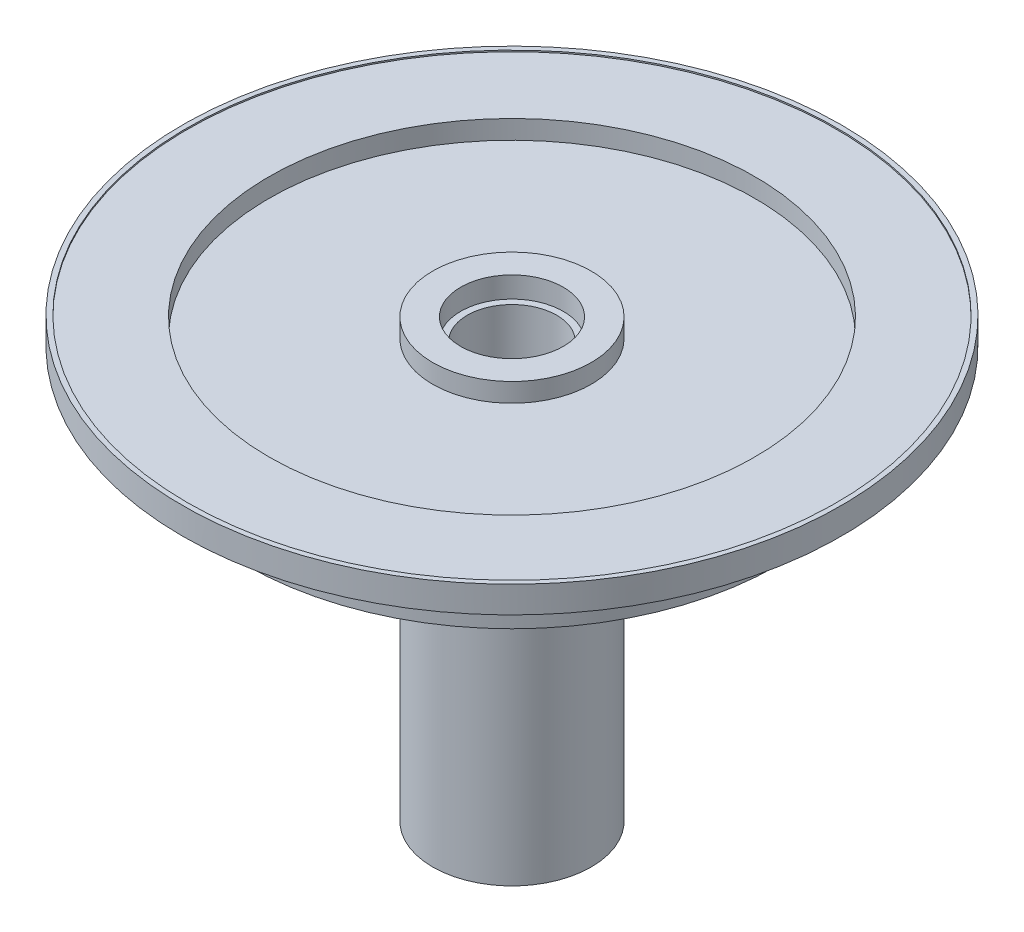
ISO-10303-21;
HEADER;
FILE_DESCRIPTION(('STEP AP214'),'2;1');
FILE_NAME('part.step','',(''),(''),'','','');
FILE_SCHEMA(('AUTOMOTIVE_DESIGN { 1 0 10303 214 1 1 1 1 }'));
ENDSEC;
DATA;
#1=APPLICATION_CONTEXT('core data for automotive mechanical design processes');
#2=APPLICATION_PROTOCOL_DEFINITION('international standard','automotive_design',2000,#1);
#3=PRODUCT_CONTEXT('',#1,'mechanical');
#4=PRODUCT('Part','Part','',(#3));
#5=PRODUCT_RELATED_PRODUCT_CATEGORY('part','',(#4));
#6=PRODUCT_DEFINITION_FORMATION('','',#4);
#7=PRODUCT_DEFINITION_CONTEXT('part definition',#1,'design');
#8=PRODUCT_DEFINITION('design','',#6,#7);
#9=PRODUCT_DEFINITION_SHAPE('','',#8);
#10=(LENGTH_UNIT() NAMED_UNIT(*) SI_UNIT(.MILLI.,.METRE.));
#11=(NAMED_UNIT(*) PLANE_ANGLE_UNIT() SI_UNIT($,.RADIAN.));
#12=(NAMED_UNIT(*) SI_UNIT($,.STERADIAN.) SOLID_ANGLE_UNIT());
#13=UNCERTAINTY_MEASURE_WITH_UNIT(LENGTH_MEASURE(1.E-05),#10,'distance_accuracy_value','');
#14=(GEOMETRIC_REPRESENTATION_CONTEXT(3) GLOBAL_UNCERTAINTY_ASSIGNED_CONTEXT((#13)) GLOBAL_UNIT_ASSIGNED_CONTEXT((#10,
#11,#12)) REPRESENTATION_CONTEXT('',''));
#15=CARTESIAN_POINT('',(0.,0.,0.));
#16=DIRECTION('',(0.,0.,1.));
#17=DIRECTION('',(1.,0.,0.));
#18=AXIS2_PLACEMENT_3D('',#15,#16,#17);
#19=CARTESIAN_POINT('',(0.,0.,0.));
#20=DIRECTION('',(0.,1.,0.));
#21=DIRECTION('',(0.,0.,1.));
#22=AXIS2_PLACEMENT_3D('',#19,#20,#21);
#23=CYLINDRICAL_SURFACE('',#22,5.35);
#24=CARTESIAN_POINT('',(0.,-30.8,0.));
#25=DIRECTION('',(0.,-1.,0.));
#26=DIRECTION('',(0.,0.,-1.));
#27=AXIS2_PLACEMENT_3D('',#24,#25,#26);
#28=CIRCLE('',#27,5.35);
#29=CARTESIAN_POINT('',(0.,-30.8,-5.35));
#30=VERTEX_POINT('',#29);
#31=EDGE_CURVE('E37',#30,#30,#28,.F.);
#32=ORIENTED_EDGE('',*,*,#31,.T.);
#33=EDGE_LOOP('',(#32));
#34=FACE_BOUND('',#33,.T.);
#35=CARTESIAN_POINT('',(0.,-35.8,0.));
#36=DIRECTION('',(0.,-1.,0.));
#37=DIRECTION('',(0.,0.,-1.));
#38=AXIS2_PLACEMENT_3D('',#35,#36,#37);
#39=CIRCLE('',#38,5.35);
#40=CARTESIAN_POINT('',(0.,-35.8,-5.35));
#41=VERTEX_POINT('',#40);
#42=EDGE_CURVE('E53',#41,#41,#39,.F.);
#43=ORIENTED_EDGE('',*,*,#42,.F.);
#44=EDGE_LOOP('',(#43));
#45=FACE_BOUND('',#44,.T.);
#46=ADVANCED_FACE('F33',(#34,#45),#23,.F.);
#47=CARTESIAN_POINT('',(0.,-47.8,0.));
#48=DIRECTION('',(0.,-1.,0.));
#49=DIRECTION('',(0.,0.,-1.));
#50=AXIS2_PLACEMENT_3D('',#47,#48,#49);
#51=PLANE('',#50);
#52=CARTESIAN_POINT('',(0.,-47.8,0.));
#53=DIRECTION('',(0.,-1.,0.));
#54=DIRECTION('',(0.,0.,-1.));
#55=AXIS2_PLACEMENT_3D('',#52,#53,#54);
#56=CIRCLE('',#55,7.35);
#57=CARTESIAN_POINT('',(0.,-47.8,-7.35));
#58=VERTEX_POINT('',#57);
#59=EDGE_CURVE('E76',#58,#58,#56,.T.);
#60=ORIENTED_EDGE('',*,*,#59,.T.);
#61=EDGE_LOOP('',(#60));
#62=FACE_BOUND('',#61,.T.);
#63=CARTESIAN_POINT('',(0.,-47.8,0.));
#64=DIRECTION('',(0.,-1.,0.));
#65=DIRECTION('',(0.,0.,-1.));
#66=AXIS2_PLACEMENT_3D('',#63,#64,#65);
#67=CIRCLE('',#66,6.4);
#68=CARTESIAN_POINT('',(0.,-47.8,-6.4));
#69=VERTEX_POINT('',#68);
#70=EDGE_CURVE('E50',#69,#69,#67,.F.);
#71=ORIENTED_EDGE('',*,*,#70,.T.);
#72=EDGE_LOOP('',(#71));
#73=FACE_BOUND('',#72,.T.);
#74=ADVANCED_FACE('F116',(#62,#73),#51,.T.);
#75=CARTESIAN_POINT('',(0.,0.,0.));
#76=DIRECTION('',(0.,1.,0.));
#77=DIRECTION('',(0.,0.,1.));
#78=AXIS2_PLACEMENT_3D('',#75,#76,#77);
#79=PLANE('',#78);
#80=CARTESIAN_POINT('',(0.,0.,0.));
#81=DIRECTION('',(0.,1.,0.));
#82=DIRECTION('',(0.,0.,1.));
#83=AXIS2_PLACEMENT_3D('',#80,#81,#82);
#84=CIRCLE('',#83,38.1);
#85=CARTESIAN_POINT('',(0.,0.,38.1));
#86=VERTEX_POINT('',#85);
#87=EDGE_CURVE('E46',#86,#86,#84,.T.);
#88=ORIENTED_EDGE('',*,*,#87,.F.);
#89=EDGE_LOOP('',(#88));
#90=FACE_BOUND('',#89,.T.);
#91=CARTESIAN_POINT('',(0.,0.,0.));
#92=DIRECTION('',(0.,1.,0.));
#93=DIRECTION('',(0.,0.,1.));
#94=AXIS2_PLACEMENT_3D('',#91,#92,#93);
#95=CIRCLE('',#94,11.35);
#96=CARTESIAN_POINT('',(0.,0.,11.35));
#97=VERTEX_POINT('',#96);
#98=EDGE_CURVE('E10',#97,#97,#95,.F.);
#99=ORIENTED_EDGE('',*,*,#98,.F.);
#100=EDGE_LOOP('',(#99));
#101=FACE_BOUND('',#100,.T.);
#102=ADVANCED_FACE('F113',(#90,#101),#79,.F.);
#103=CARTESIAN_POINT('',(0.,4.826,0.));
#104=DIRECTION('',(0.,-1.,0.));
#105=DIRECTION('',(0.,0.,-1.));
#106=AXIS2_PLACEMENT_3D('',#103,#104,#105);
#107=CYLINDRICAL_SURFACE('',#106,38.1);
#108=CARTESIAN_POINT('',(0.,4.826,0.));
#109=DIRECTION('',(0.,1.,0.));
#110=DIRECTION('',(0.,0.,1.));
#111=AXIS2_PLACEMENT_3D('',#108,#109,#110);
#112=CIRCLE('',#111,38.1);
#113=CARTESIAN_POINT('',(0.,4.826,38.1));
#114=VERTEX_POINT('',#113);
#115=EDGE_CURVE('E41',#114,#114,#112,.T.);
#116=ORIENTED_EDGE('',*,*,#115,.F.);
#117=EDGE_LOOP('',(#116));
#118=FACE_BOUND('',#117,.T.);
#119=ORIENTED_EDGE('',*,*,#87,.T.);
#120=EDGE_LOOP('',(#119));
#121=FACE_BOUND('',#120,.T.);
#122=ADVANCED_FACE('F35',(#118,#121),#107,.T.);
#123=CARTESIAN_POINT('',(0.,4.826,0.));
#124=DIRECTION('',(0.,1.,0.));
#125=DIRECTION('',(0.,0.,1.));
#126=AXIS2_PLACEMENT_3D('',#123,#124,#125);
#127=CONICAL_SURFACE('',#126,38.1,1.22173047639603);
#128=CARTESIAN_POINT('',(0.,8.128,0.));
#129=DIRECTION('',(0.,1.,0.));
#130=DIRECTION('',(0.,0.,1.));
#131=AXIS2_PLACEMENT_3D('',#128,#129,#130);
#132=CIRCLE('',#131,47.1721704390392);
#133=CARTESIAN_POINT('',(0.,8.128,-47.1721704390392));
#134=VERTEX_POINT('',#133);
#135=EDGE_CURVE('E105',#134,#134,#132,.T.);
#136=ORIENTED_EDGE('',*,*,#135,.F.);
#137=EDGE_LOOP('',(#136));
#138=FACE_BOUND('',#137,.T.);
#139=ORIENTED_EDGE('',*,*,#115,.T.);
#140=EDGE_LOOP('',(#139));
#141=FACE_BOUND('',#140,.T.);
#142=ADVANCED_FACE('F121',(#138,#141),#127,.T.);
#143=CARTESIAN_POINT('',(0.,11.938,0.));
#144=DIRECTION('',(0.,-1.,0.));
#145=DIRECTION('',(0.,0.,-1.));
#146=AXIS2_PLACEMENT_3D('',#143,#144,#145);
#147=CYLINDRICAL_SURFACE('',#146,47.1721704390392);
#148=CARTESIAN_POINT('',(0.,11.938,0.));
#149=DIRECTION('',(0.,1.,0.));
#150=DIRECTION('',(0.,0.,1.));
#151=AXIS2_PLACEMENT_3D('',#148,#149,#150);
#152=CIRCLE('',#151,47.1721704390392);
#153=CARTESIAN_POINT('',(0.,11.938,-47.1721704390392));
#154=VERTEX_POINT('',#153);
#155=EDGE_CURVE('E100',#154,#154,#152,.T.);
#156=CARTESIAN_POINT('',(0.,11.938,-47.1721704390392));
#157=CARTESIAN_POINT('',(0.,11.8983125,-47.1721704390392));
#158=CARTESIAN_POINT('',(0.,11.858625,-47.1721704390392));
#159=CARTESIAN_POINT('',(0.,11.77925,-47.1721704390392));
#160=CARTESIAN_POINT('',(0.,11.7395625,-47.1721704390392));
#161=CARTESIAN_POINT('',(0.,11.6601875,-47.1721704390392));
#162=CARTESIAN_POINT('',(0.,11.6205,-47.1721704390392));
#163=CARTESIAN_POINT('',(0.,11.541125,-47.1721704390392));
#164=CARTESIAN_POINT('',(0.,11.5014375,-47.1721704390392));
#165=CARTESIAN_POINT('',(0.,11.4220625,-47.1721704390392));
#166=CARTESIAN_POINT('',(0.,11.382375,-47.1721704390392));
#167=CARTESIAN_POINT('',(0.,11.303,-47.1721704390392));
#168=CARTESIAN_POINT('',(0.,11.2633125,-47.1721704390392));
#169=CARTESIAN_POINT('',(0.,11.1839375,-47.1721704390392));
#170=CARTESIAN_POINT('',(0.,11.14425,-47.1721704390392));
#171=CARTESIAN_POINT('',(0.,11.064875,-47.1721704390392));
#172=CARTESIAN_POINT('',(0.,11.0251875,-47.1721704390392));
#173=CARTESIAN_POINT('',(0.,10.9458125,-47.1721704390392));
#174=CARTESIAN_POINT('',(0.,10.906125,-47.1721704390392));
#175=CARTESIAN_POINT('',(0.,10.82675,-47.1721704390392));
#176=CARTESIAN_POINT('',(0.,10.7870625,-47.1721704390392));
#177=CARTESIAN_POINT('',(0.,10.7076875,-47.1721704390392));
#178=CARTESIAN_POINT('',(0.,10.668,-47.1721704390392));
#179=CARTESIAN_POINT('',(0.,10.588625,-47.1721704390392));
#180=CARTESIAN_POINT('',(0.,10.5489375,-47.1721704390392));
#181=CARTESIAN_POINT('',(0.,10.4695625,-47.1721704390392));
#182=CARTESIAN_POINT('',(0.,10.429875,-47.1721704390392));
#183=CARTESIAN_POINT('',(0.,10.3505,-47.1721704390392));
#184=CARTESIAN_POINT('',(0.,10.3108125,-47.1721704390392));
#185=CARTESIAN_POINT('',(0.,10.2314375,-47.1721704390392));
#186=CARTESIAN_POINT('',(0.,10.19175,-47.1721704390392));
#187=CARTESIAN_POINT('',(0.,10.112375,-47.1721704390392));
#188=CARTESIAN_POINT('',(0.,10.0726875,-47.1721704390392));
#189=CARTESIAN_POINT('',(0.,9.9933125,-47.1721704390392));
#190=CARTESIAN_POINT('',(0.,9.953625,-47.1721704390392));
#191=CARTESIAN_POINT('',(0.,9.87425,-47.1721704390392));
#192=CARTESIAN_POINT('',(0.,9.8345625,-47.1721704390392));
#193=CARTESIAN_POINT('',(0.,9.7551875,-47.1721704390392));
#194=CARTESIAN_POINT('',(0.,9.7155,-47.1721704390392));
#195=CARTESIAN_POINT('',(0.,9.636125,-47.1721704390392));
#196=CARTESIAN_POINT('',(0.,9.5964375,-47.1721704390392));
#197=CARTESIAN_POINT('',(0.,9.5170625,-47.1721704390392));
#198=CARTESIAN_POINT('',(0.,9.477375,-47.1721704390392));
#199=CARTESIAN_POINT('',(0.,9.398,-47.1721704390392));
#200=CARTESIAN_POINT('',(0.,9.3583125,-47.1721704390392));
#201=CARTESIAN_POINT('',(0.,9.2789375,-47.1721704390392));
#202=CARTESIAN_POINT('',(0.,9.23925,-47.1721704390392));
#203=CARTESIAN_POINT('',(0.,9.159875,-47.1721704390392));
#204=CARTESIAN_POINT('',(0.,9.1201875,-47.1721704390392));
#205=CARTESIAN_POINT('',(0.,9.0408125,-47.1721704390392));
#206=CARTESIAN_POINT('',(0.,9.001125,-47.1721704390392));
#207=CARTESIAN_POINT('',(0.,8.92175,-47.1721704390392));
#208=CARTESIAN_POINT('',(0.,8.8820625,-47.1721704390392));
#209=CARTESIAN_POINT('',(0.,8.8026875,-47.1721704390392));
#210=CARTESIAN_POINT('',(0.,8.763,-47.1721704390392));
#211=CARTESIAN_POINT('',(0.,8.683625,-47.1721704390392));
#212=CARTESIAN_POINT('',(0.,8.6439375,-47.1721704390392));
#213=CARTESIAN_POINT('',(0.,8.5645625,-47.1721704390392));
#214=CARTESIAN_POINT('',(0.,8.524875,-47.1721704390392));
#215=CARTESIAN_POINT('',(0.,8.4455,-47.1721704390392));
#216=CARTESIAN_POINT('',(0.,8.4058125,-47.1721704390392));
#217=CARTESIAN_POINT('',(0.,8.3264375,-47.1721704390392));
#218=CARTESIAN_POINT('',(0.,8.28675,-47.1721704390392));
#219=CARTESIAN_POINT('',(0.,8.207375,-47.1721704390392));
#220=CARTESIAN_POINT('',(0.,8.1676875,-47.1721704390392));
#221=CARTESIAN_POINT('',(0.,8.128,-47.1721704390392));
#222=B_SPLINE_CURVE_WITH_KNOTS('',3,(#156,#157,#158,#159,#160,#161,#162,#163,#164,#165,#166,
#167,#168,#169,#170,#171,#172,#173,#174,#175,#176,#177,#178,#179,#180,#181,#182,#183,#184,#185,
#186,#187,#188,#189,#190,#191,#192,#193,#194,#195,#196,#197,#198,#199,#200,#201,#202,#203,#204,
#205,#206,#207,#208,#209,#210,#211,#212,#213,#214,#215,#216,#217,#218,#219,#220,#221),
.UNSPECIFIED.,.F.,.F.,(4,2,2,2,2,2,2,2,2,2,2,2,2,2,2,2,2,2,2,2,2,2,2,2,2,2,2,2,2,2,2,2,4),(0.,
0.119062499999999,0.238124999999999,0.3571875,0.476249999999999,0.595312499999999,0.714375,
0.833437499999999,0.952499999999998,1.0715625,1.190625,1.3096875,1.42875,1.5478125,1.666875,
1.7859375,1.905,2.0240625,2.143125,2.2621875,2.38125,2.5003125,2.619375,2.7384375,2.8575,
2.9765625,3.095625,3.2146875,3.33375,3.4528125,3.571875,3.6909375,3.81),.UNSPECIFIED.);
#223=EDGE_CURVE('BSEAM160',#154,#134,#222,.T.);
#224=ORIENTED_EDGE('',*,*,#155,.F.);
#225=ORIENTED_EDGE('',*,*,#135,.T.);
#226=ORIENTED_EDGE('',*,*,#223,.T.);
#227=ORIENTED_EDGE('',*,*,#223,.F.);
#228=EDGE_LOOP('',(#224,#226,#225,#227));
#229=FACE_BOUND('',#228,.T.);
#230=ADVANCED_FACE('F160',(#229),#147,.T.);
#231=CARTESIAN_POINT('',(0.,11.938,0.));
#232=DIRECTION('',(0.,1.,0.));
#233=DIRECTION('',(0.,0.,1.));
#234=AXIS2_PLACEMENT_3D('',#231,#232,#233);
#235=PLANE('',#234);
#236=CARTESIAN_POINT('',(0.,11.938,0.));
#237=DIRECTION('',(0.,1.,0.));
#238=DIRECTION('',(0.,0.,1.));
#239=AXIS2_PLACEMENT_3D('',#236,#237,#238);
#240=CIRCLE('',#239,46.4721704390392);
#241=CARTESIAN_POINT('',(0.,11.938,46.4721704390392));
#242=VERTEX_POINT('',#241);
#243=EDGE_CURVE('E94',#242,#242,#240,.T.);
#244=ORIENTED_EDGE('',*,*,#243,.F.);
#245=EDGE_LOOP('',(#244));
#246=FACE_BOUND('',#245,.T.);
#247=ORIENTED_EDGE('',*,*,#155,.T.);
#248=EDGE_LOOP('',(#247));
#249=FACE_BOUND('',#248,.T.);
#250=ADVANCED_FACE('F156',(#246,#249),#235,.T.);
#251=CARTESIAN_POINT('',(0.,11.738,0.));
#252=DIRECTION('',(0.,1.,0.));
#253=DIRECTION('',(0.,0.,1.));
#254=AXIS2_PLACEMENT_3D('',#251,#252,#253);
#255=CYLINDRICAL_SURFACE('',#254,46.4721704390392);
#256=CARTESIAN_POINT('',(0.,11.738,0.));
#257=DIRECTION('',(0.,1.,0.));
#258=DIRECTION('',(0.,0.,1.));
#259=AXIS2_PLACEMENT_3D('',#256,#257,#258);
#260=CIRCLE('',#259,46.4721704390392);
#261=CARTESIAN_POINT('',(0.,11.738,46.4721704390392));
#262=VERTEX_POINT('',#261);
#263=EDGE_CURVE('E97',#262,#262,#260,.T.);
#264=ORIENTED_EDGE('',*,*,#263,.F.);
#265=EDGE_LOOP('',(#264));
#266=FACE_BOUND('',#265,.T.);
#267=ORIENTED_EDGE('',*,*,#243,.T.);
#268=EDGE_LOOP('',(#267));
#269=FACE_BOUND('',#268,.T.);
#270=ADVANCED_FACE('F152',(#266,#269),#255,.F.);
#271=CARTESIAN_POINT('',(0.,11.738,0.));
#272=DIRECTION('',(0.,1.,0.));
#273=DIRECTION('',(0.,0.,1.));
#274=AXIS2_PLACEMENT_3D('',#271,#272,#273);
#275=PLANE('',#274);
#276=CARTESIAN_POINT('',(0.,11.738,0.));
#277=DIRECTION('',(0.,1.,0.));
#278=DIRECTION('',(0.,0.,1.));
#279=AXIS2_PLACEMENT_3D('',#276,#277,#278);
#280=CIRCLE('',#279,34.7721704390392);
#281=CARTESIAN_POINT('',(0.,11.738,34.7721704390392));
#282=VERTEX_POINT('',#281);
#283=EDGE_CURVE('E88',#282,#282,#280,.T.);
#284=ORIENTED_EDGE('',*,*,#283,.F.);
#285=EDGE_LOOP('',(#284));
#286=FACE_BOUND('',#285,.T.);
#287=ORIENTED_EDGE('',*,*,#263,.T.);
#288=EDGE_LOOP('',(#287));
#289=FACE_BOUND('',#288,.T.);
#290=ADVANCED_FACE('F148',(#286,#289),#275,.T.);
#291=CARTESIAN_POINT('',(0.,9.038,0.));
#292=DIRECTION('',(0.,1.,0.));
#293=DIRECTION('',(0.,0.,1.));
#294=AXIS2_PLACEMENT_3D('',#291,#292,#293);
#295=CYLINDRICAL_SURFACE('',#294,34.7721704390392);
#296=CARTESIAN_POINT('',(0.,9.038,0.));
#297=DIRECTION('',(0.,1.,0.));
#298=DIRECTION('',(0.,0.,1.));
#299=AXIS2_PLACEMENT_3D('',#296,#297,#298);
#300=CIRCLE('',#299,34.7721704390392);
#301=CARTESIAN_POINT('',(0.,9.038,34.7721704390392));
#302=VERTEX_POINT('',#301);
#303=EDGE_CURVE('E91',#302,#302,#300,.T.);
#304=CARTESIAN_POINT('',(0.,9.038,34.7721704390392));
#305=CARTESIAN_POINT('',(0.,9.066125,34.7721704390392));
#306=CARTESIAN_POINT('',(0.,9.09425,34.7721704390392));
#307=CARTESIAN_POINT('',(0.,9.1505,34.7721704390392));
#308=CARTESIAN_POINT('',(0.,9.178625,34.7721704390392));
#309=CARTESIAN_POINT('',(0.,9.234875,34.7721704390392));
#310=CARTESIAN_POINT('',(0.,9.263,34.7721704390392));
#311=CARTESIAN_POINT('',(0.,9.31925,34.7721704390392));
#312=CARTESIAN_POINT('',(0.,9.347375,34.7721704390392));
#313=CARTESIAN_POINT('',(0.,9.403625,34.7721704390392));
#314=CARTESIAN_POINT('',(0.,9.43175,34.7721704390392));
#315=CARTESIAN_POINT('',(0.,9.488,34.7721704390392));
#316=CARTESIAN_POINT('',(0.,9.516125,34.7721704390392));
#317=CARTESIAN_POINT('',(0.,9.572375,34.7721704390392));
#318=CARTESIAN_POINT('',(0.,9.6005,34.7721704390392));
#319=CARTESIAN_POINT('',(0.,9.65675,34.7721704390392));
#320=CARTESIAN_POINT('',(0.,9.684875,34.7721704390392));
#321=CARTESIAN_POINT('',(0.,9.741125,34.7721704390392));
#322=CARTESIAN_POINT('',(0.,9.76925,34.7721704390392));
#323=CARTESIAN_POINT('',(0.,9.8255,34.7721704390392));
#324=CARTESIAN_POINT('',(0.,9.853625,34.7721704390392));
#325=CARTESIAN_POINT('',(0.,9.909875,34.7721704390392));
#326=CARTESIAN_POINT('',(0.,9.938,34.7721704390392));
#327=CARTESIAN_POINT('',(0.,9.99425,34.7721704390392));
#328=CARTESIAN_POINT('',(0.,10.022375,34.7721704390392));
#329=CARTESIAN_POINT('',(0.,10.078625,34.7721704390392));
#330=CARTESIAN_POINT('',(0.,10.10675,34.7721704390392));
#331=CARTESIAN_POINT('',(0.,10.163,34.7721704390392));
#332=CARTESIAN_POINT('',(0.,10.191125,34.7721704390392));
#333=CARTESIAN_POINT('',(0.,10.247375,34.7721704390392));
#334=CARTESIAN_POINT('',(0.,10.2755,34.7721704390392));
#335=CARTESIAN_POINT('',(0.,10.33175,34.7721704390392));
#336=CARTESIAN_POINT('',(0.,10.359875,34.7721704390392));
#337=CARTESIAN_POINT('',(0.,10.416125,34.7721704390392));
#338=CARTESIAN_POINT('',(0.,10.44425,34.7721704390392));
#339=CARTESIAN_POINT('',(0.,10.5005,34.7721704390392));
#340=CARTESIAN_POINT('',(0.,10.528625,34.7721704390392));
#341=CARTESIAN_POINT('',(0.,10.584875,34.7721704390392));
#342=CARTESIAN_POINT('',(0.,10.613,34.7721704390392));
#343=CARTESIAN_POINT('',(0.,10.66925,34.7721704390392));
#344=CARTESIAN_POINT('',(0.,10.697375,34.7721704390392));
#345=CARTESIAN_POINT('',(0.,10.753625,34.7721704390392));
#346=CARTESIAN_POINT('',(0.,10.78175,34.7721704390392));
#347=CARTESIAN_POINT('',(0.,10.838,34.7721704390392));
#348=CARTESIAN_POINT('',(0.,10.866125,34.7721704390392));
#349=CARTESIAN_POINT('',(0.,10.922375,34.7721704390392));
#350=CARTESIAN_POINT('',(0.,10.9505,34.7721704390392));
#351=CARTESIAN_POINT('',(0.,11.00675,34.7721704390392));
#352=CARTESIAN_POINT('',(0.,11.034875,34.7721704390392));
#353=CARTESIAN_POINT('',(0.,11.091125,34.7721704390392));
#354=CARTESIAN_POINT('',(0.,11.11925,34.7721704390392));
#355=CARTESIAN_POINT('',(0.,11.1755,34.7721704390392));
#356=CARTESIAN_POINT('',(0.,11.203625,34.7721704390392));
#357=CARTESIAN_POINT('',(0.,11.259875,34.7721704390392));
#358=CARTESIAN_POINT('',(0.,11.288,34.7721704390392));
#359=CARTESIAN_POINT('',(0.,11.34425,34.7721704390392));
#360=CARTESIAN_POINT('',(0.,11.372375,34.7721704390392));
#361=CARTESIAN_POINT('',(0.,11.428625,34.7721704390392));
#362=CARTESIAN_POINT('',(0.,11.45675,34.7721704390392));
#363=CARTESIAN_POINT('',(0.,11.513,34.7721704390392));
#364=CARTESIAN_POINT('',(0.,11.541125,34.7721704390392));
#365=CARTESIAN_POINT('',(0.,11.597375,34.7721704390392));
#366=CARTESIAN_POINT('',(0.,11.6255,34.7721704390392));
#367=CARTESIAN_POINT('',(0.,11.68175,34.7721704390392));
#368=CARTESIAN_POINT('',(0.,11.709875,34.7721704390392));
#369=CARTESIAN_POINT('',(0.,11.738,34.7721704390392));
#370=B_SPLINE_CURVE_WITH_KNOTS('',3,(#304,#305,#306,#307,#308,#309,#310,#311,#312,#313,#314,
#315,#316,#317,#318,#319,#320,#321,#322,#323,#324,#325,#326,#327,#328,#329,#330,#331,#332,#333,
#334,#335,#336,#337,#338,#339,#340,#341,#342,#343,#344,#345,#346,#347,#348,#349,#350,#351,#352,
#353,#354,#355,#356,#357,#358,#359,#360,#361,#362,#363,#364,#365,#366,#367,#368,#369),
.UNSPECIFIED.,.F.,.F.,(4,2,2,2,2,2,2,2,2,2,2,2,2,2,2,2,2,2,2,2,2,2,2,2,2,2,2,2,2,2,2,2,4),(0.,
0.0843749999999994,0.168749999999999,0.253125,0.337499999999999,0.421874999999999,0.50625,
0.590624999999999,0.674999999999998,0.759375,0.843749999999999,0.928125,1.0125,1.096875,1.18125,
1.265625,1.35,1.434375,1.51875,1.603125,1.6875,1.771875,1.85625,1.940625,2.025,2.109375,2.19375,
2.278125,2.3625,2.446875,2.53125,2.615625,2.7),.UNSPECIFIED.);
#371=EDGE_CURVE('BSEAM144',#302,#282,#370,.T.);
#372=ORIENTED_EDGE('',*,*,#303,.F.);
#373=ORIENTED_EDGE('',*,*,#283,.T.);
#374=ORIENTED_EDGE('',*,*,#371,.T.);
#375=ORIENTED_EDGE('',*,*,#371,.F.);
#376=EDGE_LOOP('',(#372,#374,#373,#375));
#377=FACE_BOUND('',#376,.T.);
#378=ADVANCED_FACE('F144',(#377),#295,.F.);
#379=CARTESIAN_POINT('',(0.,9.038,0.));
#380=DIRECTION('',(0.,1.,0.));
#381=DIRECTION('',(0.,0.,1.));
#382=AXIS2_PLACEMENT_3D('',#379,#380,#381);
#383=PLANE('',#382);
#384=CARTESIAN_POINT('',(0.,9.038,0.));
#385=DIRECTION('',(0.,1.,0.));
#386=DIRECTION('',(0.,0.,1.));
#387=AXIS2_PLACEMENT_3D('',#384,#385,#386);
#388=CIRCLE('',#387,11.35);
#389=CARTESIAN_POINT('',(0.,9.038,11.35));
#390=VERTEX_POINT('',#389);
#391=EDGE_CURVE('E85',#390,#390,#388,.T.);
#392=ORIENTED_EDGE('',*,*,#391,.F.);
#393=EDGE_LOOP('',(#392));
#394=FACE_BOUND('',#393,.T.);
#395=ORIENTED_EDGE('',*,*,#303,.T.);
#396=EDGE_LOOP('',(#395));
#397=FACE_BOUND('',#396,.T.);
#398=ADVANCED_FACE('F140',(#394,#397),#383,.T.);
#399=CARTESIAN_POINT('',(0.,9.038,0.));
#400=DIRECTION('',(0.,1.,0.));
#401=DIRECTION('',(0.,0.,1.));
#402=AXIS2_PLACEMENT_3D('',#399,#400,#401);
#403=CYLINDRICAL_SURFACE('',#402,11.35);
#404=CARTESIAN_POINT('',(0.,11.738,0.));
#405=DIRECTION('',(0.,1.,0.));
#406=DIRECTION('',(0.,0.,1.));
#407=AXIS2_PLACEMENT_3D('',#404,#405,#406);
#408=CIRCLE('',#407,11.35);
#409=CARTESIAN_POINT('',(0.,11.738,11.35));
#410=VERTEX_POINT('',#409);
#411=EDGE_CURVE('E84',#410,#410,#408,.T.);
#412=CARTESIAN_POINT('',(0.,9.038,11.35));
#413=CARTESIAN_POINT('',(0.,9.066125,11.35));
#414=CARTESIAN_POINT('',(0.,9.09425,11.35));
#415=CARTESIAN_POINT('',(0.,9.1505,11.35));
#416=CARTESIAN_POINT('',(0.,9.178625,11.35));
#417=CARTESIAN_POINT('',(0.,9.234875,11.35));
#418=CARTESIAN_POINT('',(0.,9.263,11.35));
#419=CARTESIAN_POINT('',(0.,9.31925,11.35));
#420=CARTESIAN_POINT('',(0.,9.347375,11.35));
#421=CARTESIAN_POINT('',(0.,9.403625,11.35));
#422=CARTESIAN_POINT('',(0.,9.43175,11.35));
#423=CARTESIAN_POINT('',(0.,9.488,11.35));
#424=CARTESIAN_POINT('',(0.,9.516125,11.35));
#425=CARTESIAN_POINT('',(0.,9.572375,11.35));
#426=CARTESIAN_POINT('',(0.,9.6005,11.35));
#427=CARTESIAN_POINT('',(0.,9.65675,11.35));
#428=CARTESIAN_POINT('',(0.,9.684875,11.35));
#429=CARTESIAN_POINT('',(0.,9.741125,11.35));
#430=CARTESIAN_POINT('',(0.,9.76925,11.35));
#431=CARTESIAN_POINT('',(0.,9.8255,11.35));
#432=CARTESIAN_POINT('',(0.,9.853625,11.35));
#433=CARTESIAN_POINT('',(0.,9.909875,11.35));
#434=CARTESIAN_POINT('',(0.,9.938,11.35));
#435=CARTESIAN_POINT('',(0.,9.99425,11.35));
#436=CARTESIAN_POINT('',(0.,10.022375,11.35));
#437=CARTESIAN_POINT('',(0.,10.078625,11.35));
#438=CARTESIAN_POINT('',(0.,10.10675,11.35));
#439=CARTESIAN_POINT('',(0.,10.163,11.35));
#440=CARTESIAN_POINT('',(0.,10.191125,11.35));
#441=CARTESIAN_POINT('',(0.,10.247375,11.35));
#442=CARTESIAN_POINT('',(0.,10.2755,11.35));
#443=CARTESIAN_POINT('',(0.,10.33175,11.35));
#444=CARTESIAN_POINT('',(0.,10.359875,11.35));
#445=CARTESIAN_POINT('',(0.,10.416125,11.35));
#446=CARTESIAN_POINT('',(0.,10.44425,11.35));
#447=CARTESIAN_POINT('',(0.,10.5005,11.35));
#448=CARTESIAN_POINT('',(0.,10.528625,11.35));
#449=CARTESIAN_POINT('',(0.,10.584875,11.35));
#450=CARTESIAN_POINT('',(0.,10.613,11.35));
#451=CARTESIAN_POINT('',(0.,10.66925,11.35));
#452=CARTESIAN_POINT('',(0.,10.697375,11.35));
#453=CARTESIAN_POINT('',(0.,10.753625,11.35));
#454=CARTESIAN_POINT('',(0.,10.78175,11.35));
#455=CARTESIAN_POINT('',(0.,10.838,11.35));
#456=CARTESIAN_POINT('',(0.,10.866125,11.35));
#457=CARTESIAN_POINT('',(0.,10.922375,11.35));
#458=CARTESIAN_POINT('',(0.,10.9505,11.35));
#459=CARTESIAN_POINT('',(0.,11.00675,11.35));
#460=CARTESIAN_POINT('',(0.,11.034875,11.35));
#461=CARTESIAN_POINT('',(0.,11.091125,11.35));
#462=CARTESIAN_POINT('',(0.,11.11925,11.35));
#463=CARTESIAN_POINT('',(0.,11.1755,11.35));
#464=CARTESIAN_POINT('',(0.,11.203625,11.35));
#465=CARTESIAN_POINT('',(0.,11.259875,11.35));
#466=CARTESIAN_POINT('',(0.,11.288,11.35));
#467=CARTESIAN_POINT('',(0.,11.34425,11.35));
#468=CARTESIAN_POINT('',(0.,11.372375,11.35));
#469=CARTESIAN_POINT('',(0.,11.428625,11.35));
#470=CARTESIAN_POINT('',(0.,11.45675,11.35));
#471=CARTESIAN_POINT('',(0.,11.513,11.35));
#472=CARTESIAN_POINT('',(0.,11.541125,11.35));
#473=CARTESIAN_POINT('',(0.,11.597375,11.35));
#474=CARTESIAN_POINT('',(0.,11.6255,11.35));
#475=CARTESIAN_POINT('',(0.,11.68175,11.35));
#476=CARTESIAN_POINT('',(0.,11.709875,11.35));
#477=CARTESIAN_POINT('',(0.,11.738,11.35));
#478=B_SPLINE_CURVE_WITH_KNOTS('',3,(#412,#413,#414,#415,#416,#417,#418,#419,#420,#421,#422,
#423,#424,#425,#426,#427,#428,#429,#430,#431,#432,#433,#434,#435,#436,#437,#438,#439,#440,#441,
#442,#443,#444,#445,#446,#447,#448,#449,#450,#451,#452,#453,#454,#455,#456,#457,#458,#459,#460,
#461,#462,#463,#464,#465,#466,#467,#468,#469,#470,#471,#472,#473,#474,#475,#476,#477),
.UNSPECIFIED.,.F.,.F.,(4,2,2,2,2,2,2,2,2,2,2,2,2,2,2,2,2,2,2,2,2,2,2,2,2,2,2,2,2,2,2,2,4),(0.,
0.0843749999999994,0.168749999999999,0.253125,0.337499999999999,0.421874999999999,0.50625,
0.590624999999999,0.674999999999998,0.759375,0.843749999999999,0.928125,1.0125,1.096875,1.18125,
1.265625,1.35,1.434375,1.51875,1.603125,1.6875,1.771875,1.85625,1.940625,2.025,2.109375,2.19375,
2.278125,2.3625,2.446875,2.53125,2.615625,2.7),.UNSPECIFIED.);
#479=EDGE_CURVE('BSEAM136',#390,#410,#478,.T.);
#480=ORIENTED_EDGE('',*,*,#391,.T.);
#481=ORIENTED_EDGE('',*,*,#411,.F.);
#482=ORIENTED_EDGE('',*,*,#479,.T.);
#483=ORIENTED_EDGE('',*,*,#479,.F.);
#484=EDGE_LOOP('',(#480,#482,#481,#483));
#485=FACE_BOUND('',#484,.T.);
#486=ADVANCED_FACE('F136',(#485),#403,.T.);
#487=CARTESIAN_POINT('',(0.,11.738,0.));
#488=DIRECTION('',(0.,1.,0.));
#489=DIRECTION('',(0.,0.,1.));
#490=AXIS2_PLACEMENT_3D('',#487,#488,#489);
#491=CIRCLE('',#490,7.35);
#492=CARTESIAN_POINT('',(0.,11.738,7.35));
#493=VERTEX_POINT('',#492);
#494=EDGE_CURVE('E56',#493,#493,#491,.T.);
#495=ORIENTED_EDGE('',*,*,#494,.F.);
#496=EDGE_LOOP('',(#495));
#497=FACE_BOUND('',#496,.T.);
#498=ORIENTED_EDGE('',*,*,#411,.T.);
#499=EDGE_LOOP('',(#498));
#500=FACE_BOUND('',#499,.T.);
#501=ADVANCED_FACE('F139',(#497,#500),#275,.T.);
#502=CARTESIAN_POINT('',(0.,-50.8,0.));
#503=DIRECTION('',(0.,-1.,0.));
#504=DIRECTION('',(0.,0.,-1.));
#505=AXIS2_PLACEMENT_3D('',#502,#503,#504);
#506=PLANE('',#505);
#507=CARTESIAN_POINT('',(0.,-50.8,0.));
#508=DIRECTION('',(0.,-1.,0.));
#509=DIRECTION('',(0.,0.,-1.));
#510=AXIS2_PLACEMENT_3D('',#507,#508,#509);
#511=CIRCLE('',#510,7.35);
#512=CARTESIAN_POINT('',(0.,-50.8,-7.35));
#513=VERTEX_POINT('',#512);
#514=EDGE_CURVE('E73',#513,#513,#511,.T.);
#515=ORIENTED_EDGE('',*,*,#514,.F.);
#516=EDGE_LOOP('',(#515));
#517=FACE_BOUND('',#516,.T.);
#518=CARTESIAN_POINT('',(0.,-50.8,0.));
#519=DIRECTION('',(0.,-1.,0.));
#520=DIRECTION('',(0.,0.,-1.));
#521=AXIS2_PLACEMENT_3D('',#518,#519,#520);
#522=CIRCLE('',#521,11.35);
#523=CARTESIAN_POINT('',(0.,-50.8,-11.35));
#524=VERTEX_POINT('',#523);
#525=EDGE_CURVE('E79',#524,#524,#522,.T.);
#526=ORIENTED_EDGE('',*,*,#525,.T.);
#527=EDGE_LOOP('',(#526));
#528=FACE_BOUND('',#527,.T.);
#529=ADVANCED_FACE('F206',(#517,#528),#506,.T.);
#530=CARTESIAN_POINT('',(0.,-50.8,0.));
#531=DIRECTION('',(0.,1.,0.));
#532=DIRECTION('',(0.,0.,1.));
#533=AXIS2_PLACEMENT_3D('',#530,#531,#532);
#534=CYLINDRICAL_SURFACE('',#533,11.35);
#535=ORIENTED_EDGE('',*,*,#525,.F.);
#536=EDGE_LOOP('',(#535));
#537=FACE_BOUND('',#536,.T.);
#538=ORIENTED_EDGE('',*,*,#98,.T.);
#539=EDGE_LOOP('',(#538));
#540=FACE_BOUND('',#539,.T.);
#541=ADVANCED_FACE('F134',(#537,#540),#534,.T.);
#542=CARTESIAN_POINT('',(0.,-47.8,0.));
#543=DIRECTION('',(0.,-1.,0.));
#544=DIRECTION('',(0.,0.,-1.));
#545=AXIS2_PLACEMENT_3D('',#542,#543,#544);
#546=CYLINDRICAL_SURFACE('',#545,7.35);
#547=ORIENTED_EDGE('',*,*,#59,.F.);
#548=EDGE_LOOP('',(#547));
#549=FACE_BOUND('',#548,.T.);
#550=ORIENTED_EDGE('',*,*,#514,.T.);
#551=EDGE_LOOP('',(#550));
#552=FACE_BOUND('',#551,.T.);
#553=ADVANCED_FACE('F221',(#549,#552),#546,.F.);
#554=CARTESIAN_POINT('',(0.,8.738,0.));
#555=DIRECTION('',(0.,1.,0.));
#556=DIRECTION('',(0.,0.,1.));
#557=AXIS2_PLACEMENT_3D('',#554,#555,#556);
#558=PLANE('',#557);
#559=CARTESIAN_POINT('',(0.,8.738,0.));
#560=DIRECTION('',(0.,1.,0.));
#561=DIRECTION('',(0.,0.,1.));
#562=AXIS2_PLACEMENT_3D('',#559,#560,#561);
#563=CIRCLE('',#562,6.4);
#564=CARTESIAN_POINT('',(0.,8.738,6.4));
#565=VERTEX_POINT('',#564);
#566=EDGE_CURVE('E57',#565,#565,#563,.T.);
#567=ORIENTED_EDGE('',*,*,#566,.F.);
#568=EDGE_LOOP('',(#567));
#569=FACE_BOUND('',#568,.T.);
#570=CARTESIAN_POINT('',(0.,8.738,0.));
#571=DIRECTION('',(0.,1.,0.));
#572=DIRECTION('',(0.,0.,1.));
#573=AXIS2_PLACEMENT_3D('',#570,#571,#572);
#574=CIRCLE('',#573,7.35);
#575=CARTESIAN_POINT('',(0.,8.738,7.35));
#576=VERTEX_POINT('',#575);
#577=EDGE_CURVE('E70',#576,#576,#574,.T.);
#578=ORIENTED_EDGE('',*,*,#577,.T.);
#579=EDGE_LOOP('',(#578));
#580=FACE_BOUND('',#579,.T.);
#581=ADVANCED_FACE('F227',(#569,#580),#558,.T.);
#582=CARTESIAN_POINT('',(0.,8.738,0.));
#583=DIRECTION('',(0.,1.,0.));
#584=DIRECTION('',(0.,0.,1.));
#585=AXIS2_PLACEMENT_3D('',#582,#583,#584);
#586=CYLINDRICAL_SURFACE('',#585,7.35);
#587=ORIENTED_EDGE('',*,*,#577,.F.);
#588=EDGE_LOOP('',(#587));
#589=FACE_BOUND('',#588,.T.);
#590=ORIENTED_EDGE('',*,*,#494,.T.);
#591=EDGE_LOOP('',(#590));
#592=FACE_BOUND('',#591,.T.);
#593=ADVANCED_FACE('F235',(#589,#592),#586,.F.);
#594=CARTESIAN_POINT('',(0.,-35.8,0.));
#595=DIRECTION('',(0.,-1.,0.));
#596=DIRECTION('',(0.,0.,-1.));
#597=AXIS2_PLACEMENT_3D('',#594,#595,#596);
#598=PLANE('',#597);
#599=CARTESIAN_POINT('',(0.,-35.8,0.));
#600=DIRECTION('',(0.,-1.,0.));
#601=DIRECTION('',(0.,0.,-1.));
#602=AXIS2_PLACEMENT_3D('',#599,#600,#601);
#603=CIRCLE('',#602,6.4);
#604=CARTESIAN_POINT('',(0.,-35.8,-6.4));
#605=VERTEX_POINT('',#604);
#606=EDGE_CURVE('E54',#605,#605,#603,.T.);
#607=ORIENTED_EDGE('',*,*,#606,.T.);
#608=EDGE_LOOP('',(#607));
#609=FACE_BOUND('',#608,.T.);
#610=ORIENTED_EDGE('',*,*,#42,.T.);
#611=EDGE_LOOP('',(#610));
#612=FACE_BOUND('',#611,.T.);
#613=ADVANCED_FACE('F243',(#609,#612),#598,.T.);
#614=CARTESIAN_POINT('',(0.,-50.8,0.));
#615=DIRECTION('',(0.,1.,0.));
#616=DIRECTION('',(0.,0.,1.));
#617=AXIS2_PLACEMENT_3D('',#614,#615,#616);
#618=CYLINDRICAL_SURFACE('',#617,6.4);
#619=ORIENTED_EDGE('',*,*,#70,.F.);
#620=EDGE_LOOP('',(#619));
#621=FACE_BOUND('',#620,.T.);
#622=ORIENTED_EDGE('',*,*,#606,.F.);
#623=EDGE_LOOP('',(#622));
#624=FACE_BOUND('',#623,.T.);
#625=ADVANCED_FACE('F252',(#621,#624),#618,.F.);
#626=CARTESIAN_POINT('',(0.,-30.8,0.));
#627=DIRECTION('',(0.,-1.,0.));
#628=DIRECTION('',(0.,0.,-1.));
#629=AXIS2_PLACEMENT_3D('',#626,#627,#628);
#630=PLANE('',#629);
#631=CARTESIAN_POINT('',(0.,-30.8,0.));
#632=DIRECTION('',(0.,-1.,0.));
#633=DIRECTION('',(0.,0.,-1.));
#634=AXIS2_PLACEMENT_3D('',#631,#632,#633);
#635=CIRCLE('',#634,6.4);
#636=CARTESIAN_POINT('',(0.,-30.8,-6.4));
#637=VERTEX_POINT('',#636);
#638=EDGE_CURVE('E59',#637,#637,#635,.T.);
#639=ORIENTED_EDGE('',*,*,#638,.F.);
#640=EDGE_LOOP('',(#639));
#641=FACE_BOUND('',#640,.T.);
#642=ORIENTED_EDGE('',*,*,#31,.F.);
#643=EDGE_LOOP('',(#642));
#644=FACE_BOUND('',#643,.T.);
#645=ADVANCED_FACE('F260',(#641,#644),#630,.F.);
#646=CARTESIAN_POINT('',(0.,11.938,0.));
#647=DIRECTION('',(0.,-1.,0.));
#648=DIRECTION('',(0.,0.,-1.));
#649=AXIS2_PLACEMENT_3D('',#646,#647,#648);
#650=CYLINDRICAL_SURFACE('',#649,6.4);
#651=ORIENTED_EDGE('',*,*,#566,.T.);
#652=EDGE_LOOP('',(#651));
#653=FACE_BOUND('',#652,.T.);
#654=ORIENTED_EDGE('',*,*,#638,.T.);
#655=EDGE_LOOP('',(#654));
#656=FACE_BOUND('',#655,.T.);
#657=ADVANCED_FACE('F267',(#653,#656),#650,.F.);
#658=CLOSED_SHELL('',(#46,#74,#102,#122,#142,#230,#250,#270,#290,#378,#398,#486,#501,#529,#541,
#553,#581,#593,#613,#625,#645,#657));
#659=MANIFOLD_SOLID_BREP('B2',#658);
#660=ADVANCED_BREP_SHAPE_REPRESENTATION('',(#18,#659),#14);
#661=SHAPE_DEFINITION_REPRESENTATION(#9,#660);
ENDSEC;
END-ISO-10303-21;
